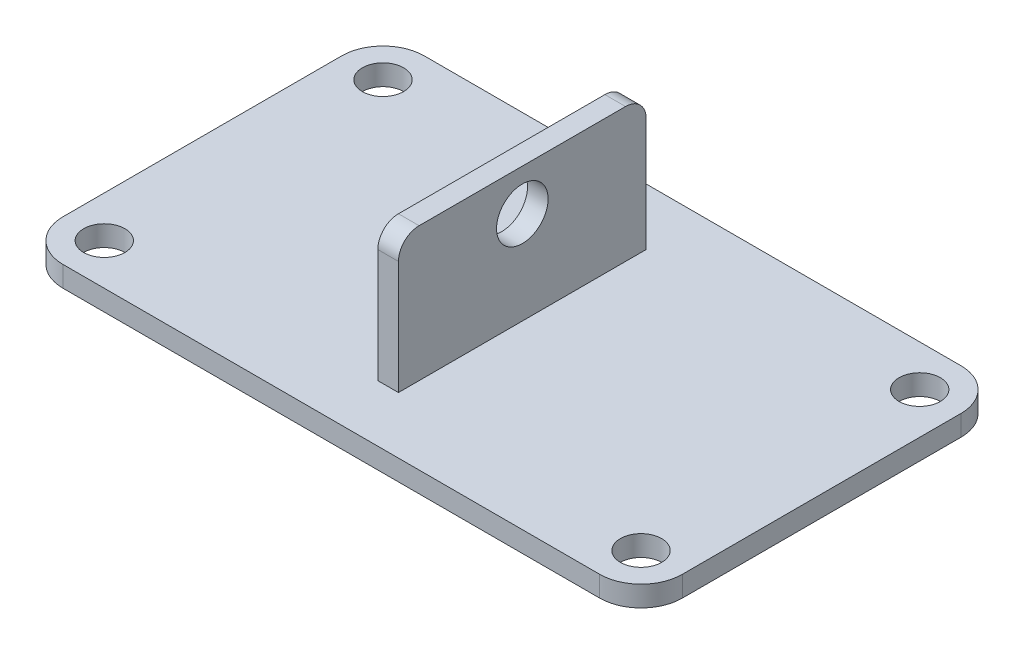
ISO-10303-21;
HEADER;
FILE_DESCRIPTION(('STEP AP214'),'2;1');
FILE_NAME('part.step','',(''),(''),'','','');
FILE_SCHEMA(('AUTOMOTIVE_DESIGN { 1 0 10303 214 1 1 1 1 }'));
ENDSEC;
DATA;
#1=APPLICATION_CONTEXT('core data for automotive mechanical design processes');
#2=APPLICATION_PROTOCOL_DEFINITION('international standard','automotive_design',2000,#1);
#3=PRODUCT_CONTEXT('',#1,'mechanical');
#4=PRODUCT('Part','Part','',(#3));
#5=PRODUCT_RELATED_PRODUCT_CATEGORY('part','',(#4));
#6=PRODUCT_DEFINITION_FORMATION('','',#4);
#7=PRODUCT_DEFINITION_CONTEXT('part definition',#1,'design');
#8=PRODUCT_DEFINITION('design','',#6,#7);
#9=PRODUCT_DEFINITION_SHAPE('','',#8);
#10=(LENGTH_UNIT() NAMED_UNIT(*) SI_UNIT(.MILLI.,.METRE.));
#11=(NAMED_UNIT(*) PLANE_ANGLE_UNIT() SI_UNIT($,.RADIAN.));
#12=(NAMED_UNIT(*) SI_UNIT($,.STERADIAN.) SOLID_ANGLE_UNIT());
#13=UNCERTAINTY_MEASURE_WITH_UNIT(LENGTH_MEASURE(1.E-05),#10,'distance_accuracy_value','');
#14=(GEOMETRIC_REPRESENTATION_CONTEXT(3) GLOBAL_UNCERTAINTY_ASSIGNED_CONTEXT((#13)) GLOBAL_UNIT_ASSIGNED_CONTEXT((#10,
#11,#12)) REPRESENTATION_CONTEXT('',''));
#15=CARTESIAN_POINT('',(0.,0.,0.));
#16=DIRECTION('',(0.,0.,1.));
#17=DIRECTION('',(1.,0.,0.));
#18=AXIS2_PLACEMENT_3D('',#15,#16,#17);
#19=CARTESIAN_POINT('',(0.,75.,-60.));
#20=DIRECTION('',(0.,0.,-1.));
#21=DIRECTION('',(-1.,0.,0.));
#22=AXIS2_PLACEMENT_3D('',#19,#20,#21);
#23=PLANE('',#22);
#24=DIRECTION('',(0.,-1.,0.));
#25=VECTOR('',#24,1.);
#26=CARTESIAN_POINT('',(-4.99999999999998,75.,-60.));
#27=LINE('',#26,#25);
#28=CARTESIAN_POINT('',(-4.99999999999998,64.9999999999999,-60.));
#29=VERTEX_POINT('',#28);
#30=CARTESIAN_POINT('',(-4.99999999999998,9.99999999999999,-60.));
#31=VERTEX_POINT('',#30);
#32=EDGE_CURVE('E182',#29,#31,#27,.T.);
#33=ORIENTED_EDGE('',*,*,#32,.F.);
#34=DIRECTION('',(1.,0.,0.));
#35=VECTOR('',#34,1.);
#36=CARTESIAN_POINT('',(-4.99999999999998,64.9999999999999,-60.));
#37=LINE('',#36,#35);
#38=CARTESIAN_POINT('',(5.00000000000002,64.9999999999999,-60.));
#39=VERTEX_POINT('',#38);
#40=EDGE_CURVE('E367',#29,#39,#37,.T.);
#41=ORIENTED_EDGE('',*,*,#40,.T.);
#42=DIRECTION('',(0.,-1.,0.));
#43=VECTOR('',#42,1.);
#44=CARTESIAN_POINT('',(5.00000000000002,75.,-60.));
#45=LINE('',#44,#43);
#46=CARTESIAN_POINT('',(5.00000000000002,9.99999999999999,-60.));
#47=VERTEX_POINT('',#46);
#48=EDGE_CURVE('E184',#39,#47,#45,.T.);
#49=ORIENTED_EDGE('',*,*,#48,.T.);
#50=DIRECTION('',(-1.,0.,0.));
#51=VECTOR('',#50,1.);
#52=CARTESIAN_POINT('',(0.,10.,-60.));
#53=LINE('',#52,#51);
#54=EDGE_CURVE('E205',#47,#31,#53,.T.);
#55=ORIENTED_EDGE('',*,*,#54,.T.);
#56=EDGE_LOOP('',(#33,#41,#49,#55));
#57=FACE_BOUND('',#56,.T.);
#58=ADVANCED_FACE('F65',(#57),#23,.T.);
#59=CARTESIAN_POINT('',(0.,75.,0.));
#60=DIRECTION('',(0.,1.,0.));
#61=DIRECTION('',(0.,0.,1.));
#62=AXIS2_PLACEMENT_3D('',#59,#60,#61);
#63=PLANE('',#62);
#64=DIRECTION('',(1.,0.,0.));
#65=VECTOR('',#64,1.);
#66=CARTESIAN_POINT('',(-4.99999999999998,75.,-50.));
#67=LINE('',#66,#65);
#68=CARTESIAN_POINT('',(-4.99999999999998,75.,-50.));
#69=VERTEX_POINT('',#68);
#70=CARTESIAN_POINT('',(5.00000000000002,75.,-50.));
#71=VERTEX_POINT('',#70);
#72=EDGE_CURVE('E81',#69,#71,#67,.T.);
#73=ORIENTED_EDGE('',*,*,#72,.F.);
#74=DIRECTION('',(0.,0.,-1.));
#75=VECTOR('',#74,1.);
#76=CARTESIAN_POINT('',(-4.99999999999998,75.,0.));
#77=LINE('',#76,#75);
#78=CARTESIAN_POINT('',(-4.99999999999998,75.,49.9999999999999));
#79=VERTEX_POINT('',#78);
#80=EDGE_CURVE('E177',#79,#69,#77,.T.);
#81=ORIENTED_EDGE('',*,*,#80,.F.);
#82=DIRECTION('',(1.,0.,0.));
#83=VECTOR('',#82,1.);
#84=CARTESIAN_POINT('',(-4.99999999999998,75.,49.9999999999999));
#85=LINE('',#84,#83);
#86=CARTESIAN_POINT('',(5.00000000000002,75.,49.9999999999999));
#87=VERTEX_POINT('',#86);
#88=EDGE_CURVE('E159',#79,#87,#85,.T.);
#89=ORIENTED_EDGE('',*,*,#88,.T.);
#90=DIRECTION('',(0.,0.,-1.));
#91=VECTOR('',#90,1.);
#92=CARTESIAN_POINT('',(5.00000000000002,75.,60.));
#93=LINE('',#92,#91);
#94=EDGE_CURVE('E187',#87,#71,#93,.T.);
#95=ORIENTED_EDGE('',*,*,#94,.T.);
#96=EDGE_LOOP('',(#73,#81,#89,#95));
#97=FACE_BOUND('',#96,.T.);
#98=ADVANCED_FACE('F176',(#97),#63,.T.);
#99=CARTESIAN_POINT('',(-4.99999999999998,75.,60.));
#100=DIRECTION('',(0.,0.,-1.));
#101=DIRECTION('',(-1.,0.,0.));
#102=AXIS2_PLACEMENT_3D('',#99,#100,#101);
#103=PLANE('',#102);
#104=DIRECTION('',(1.,0.,0.));
#105=VECTOR('',#104,1.);
#106=CARTESIAN_POINT('',(-4.99999999999998,64.9999999999999,60.));
#107=LINE('',#106,#105);
#108=CARTESIAN_POINT('',(-4.99999999999998,64.9999999999999,60.));
#109=VERTEX_POINT('',#108);
#110=CARTESIAN_POINT('',(5.00000000000002,65.,60.));
#111=VERTEX_POINT('',#110);
#112=EDGE_CURVE('E80',#109,#111,#107,.T.);
#113=ORIENTED_EDGE('',*,*,#112,.F.);
#114=DIRECTION('',(0.,-1.,0.));
#115=VECTOR('',#114,1.);
#116=CARTESIAN_POINT('',(-4.99999999999998,75.,60.));
#117=LINE('',#116,#115);
#118=CARTESIAN_POINT('',(-4.99999999999998,9.99999999999999,60.));
#119=VERTEX_POINT('',#118);
#120=EDGE_CURVE('E178',#109,#119,#117,.T.);
#121=ORIENTED_EDGE('',*,*,#120,.T.);
#122=DIRECTION('',(-1.,0.,0.));
#123=VECTOR('',#122,1.);
#124=CARTESIAN_POINT('',(0.,10.,60.));
#125=LINE('',#124,#123);
#126=CARTESIAN_POINT('',(5.00000000000002,10.,60.));
#127=VERTEX_POINT('',#126);
#128=EDGE_CURVE('E200',#127,#119,#125,.T.);
#129=ORIENTED_EDGE('',*,*,#128,.F.);
#130=DIRECTION('',(0.,-1.,0.));
#131=VECTOR('',#130,1.);
#132=CARTESIAN_POINT('',(5.00000000000002,75.,60.));
#133=LINE('',#132,#131);
#134=EDGE_CURVE('E185',#111,#127,#133,.T.);
#135=ORIENTED_EDGE('',*,*,#134,.F.);
#136=EDGE_LOOP('',(#113,#121,#129,#135));
#137=FACE_BOUND('',#136,.T.);
#138=ADVANCED_FACE('F341',(#137),#103,.F.);
#139=CARTESIAN_POINT('',(-130.,10.,-67.5));
#140=DIRECTION('',(0.,-1.,0.));
#141=DIRECTION('',(0.,0.,-1.));
#142=AXIS2_PLACEMENT_3D('',#139,#140,#141);
#143=CYLINDRICAL_SURFACE('',#142,20.);
#144=CARTESIAN_POINT('',(-130.,0.,-67.5));
#145=DIRECTION('',(0.,1.,0.));
#146=DIRECTION('',(0.,0.,1.));
#147=AXIS2_PLACEMENT_3D('',#144,#145,#146);
#148=CIRCLE('',#147,20.);
#149=CARTESIAN_POINT('',(-150.,0.,-67.4999999999999));
#150=VERTEX_POINT('',#149);
#151=CARTESIAN_POINT('',(-130.,0.,-87.5));
#152=VERTEX_POINT('',#151);
#153=EDGE_CURVE('E258',#150,#152,#148,.F.);
#154=ORIENTED_EDGE('',*,*,#153,.F.);
#155=DIRECTION('',(0.,-1.,0.));
#156=VECTOR('',#155,1.);
#157=CARTESIAN_POINT('',(-150.,10.,-67.4999999999999));
#158=LINE('',#157,#156);
#159=CARTESIAN_POINT('',(-150.,10.,-67.4999999999999));
#160=VERTEX_POINT('',#159);
#161=EDGE_CURVE('E12',#160,#150,#158,.T.);
#162=ORIENTED_EDGE('',*,*,#161,.F.);
#163=CARTESIAN_POINT('',(-130.,10.,-67.5));
#164=DIRECTION('',(0.,1.,0.));
#165=DIRECTION('',(0.,0.,1.));
#166=AXIS2_PLACEMENT_3D('',#163,#164,#165);
#167=CIRCLE('',#166,20.);
#168=CARTESIAN_POINT('',(-130.,10.,-87.5));
#169=VERTEX_POINT('',#168);
#170=EDGE_CURVE('E222',#160,#169,#167,.F.);
#171=ORIENTED_EDGE('',*,*,#170,.T.);
#172=DIRECTION('',(0.,-1.,0.));
#173=VECTOR('',#172,1.);
#174=CARTESIAN_POINT('',(-130.,10.,-87.5));
#175=LINE('',#174,#173);
#176=EDGE_CURVE('E241',#169,#152,#175,.T.);
#177=ORIENTED_EDGE('',*,*,#176,.T.);
#178=EDGE_LOOP('',(#154,#162,#171,#177));
#179=FACE_BOUND('',#178,.T.);
#180=ADVANCED_FACE('F307',(#179),#143,.T.);
#181=CARTESIAN_POINT('',(-150.,10.,0.));
#182=DIRECTION('',(-1.,0.,0.));
#183=DIRECTION('',(0.,0.,1.));
#184=AXIS2_PLACEMENT_3D('',#181,#182,#183);
#185=PLANE('',#184);
#186=DIRECTION('',(0.,0.,-1.));
#187=VECTOR('',#186,1.);
#188=CARTESIAN_POINT('',(-150.,0.,0.));
#189=LINE('',#188,#187);
#190=CARTESIAN_POINT('',(-150.,0.,67.4999999999999));
#191=VERTEX_POINT('',#190);
#192=EDGE_CURVE('E259',#191,#150,#189,.T.);
#193=ORIENTED_EDGE('',*,*,#192,.F.);
#194=DIRECTION('',(0.,-1.,0.));
#195=VECTOR('',#194,1.);
#196=CARTESIAN_POINT('',(-150.,10.,67.4999999999999));
#197=LINE('',#196,#195);
#198=CARTESIAN_POINT('',(-150.,10.,67.4999999999999));
#199=VERTEX_POINT('',#198);
#200=EDGE_CURVE('E66',#199,#191,#197,.T.);
#201=ORIENTED_EDGE('',*,*,#200,.F.);
#202=DIRECTION('',(0.,0.,-1.));
#203=VECTOR('',#202,1.);
#204=CARTESIAN_POINT('',(-150.,10.,0.));
#205=LINE('',#204,#203);
#206=EDGE_CURVE('E221',#199,#160,#205,.T.);
#207=ORIENTED_EDGE('',*,*,#206,.T.);
#208=ORIENTED_EDGE('',*,*,#161,.T.);
#209=EDGE_LOOP('',(#193,#201,#207,#208));
#210=FACE_BOUND('',#209,.T.);
#211=ADVANCED_FACE('F303',(#210),#185,.T.);
#212=CARTESIAN_POINT('',(-130.,10.,67.5));
#213=DIRECTION('',(0.,-1.,0.));
#214=DIRECTION('',(0.,0.,-1.));
#215=AXIS2_PLACEMENT_3D('',#212,#213,#214);
#216=CYLINDRICAL_SURFACE('',#215,20.);
#217=CARTESIAN_POINT('',(-130.,0.,67.5));
#218=DIRECTION('',(0.,1.,0.));
#219=DIRECTION('',(0.,0.,1.));
#220=AXIS2_PLACEMENT_3D('',#217,#218,#219);
#221=CIRCLE('',#220,20.);
#222=CARTESIAN_POINT('',(-130.,0.,87.5));
#223=VERTEX_POINT('',#222);
#224=EDGE_CURVE('E265',#191,#223,#221,.T.);
#225=ORIENTED_EDGE('',*,*,#224,.T.);
#226=DIRECTION('',(0.,-1.,0.));
#227=VECTOR('',#226,1.);
#228=CARTESIAN_POINT('',(-130.,10.,87.5));
#229=LINE('',#228,#227);
#230=CARTESIAN_POINT('',(-130.,10.,87.5));
#231=VERTEX_POINT('',#230);
#232=EDGE_CURVE('E292',#231,#223,#229,.T.);
#233=ORIENTED_EDGE('',*,*,#232,.F.);
#234=CARTESIAN_POINT('',(-130.,10.,67.5));
#235=DIRECTION('',(0.,1.,0.));
#236=DIRECTION('',(0.,0.,1.));
#237=AXIS2_PLACEMENT_3D('',#234,#235,#236);
#238=CIRCLE('',#237,20.);
#239=EDGE_CURVE('E230',#199,#231,#238,.T.);
#240=ORIENTED_EDGE('',*,*,#239,.F.);
#241=ORIENTED_EDGE('',*,*,#200,.T.);
#242=EDGE_LOOP('',(#225,#233,#240,#241));
#243=FACE_BOUND('',#242,.T.);
#244=ADVANCED_FACE('F297',(#243),#216,.T.);
#245=CARTESIAN_POINT('',(0.,10.,87.5));
#246=DIRECTION('',(0.,0.,-1.));
#247=DIRECTION('',(-1.,0.,0.));
#248=AXIS2_PLACEMENT_3D('',#245,#246,#247);
#249=PLANE('',#248);
#250=DIRECTION('',(1.,0.,0.));
#251=VECTOR('',#250,1.);
#252=CARTESIAN_POINT('',(0.,0.,87.5));
#253=LINE('',#252,#251);
#254=CARTESIAN_POINT('',(130.,0.,87.5));
#255=VERTEX_POINT('',#254);
#256=EDGE_CURVE('E264',#223,#255,#253,.T.);
#257=ORIENTED_EDGE('',*,*,#256,.T.);
#258=DIRECTION('',(0.,-1.,0.));
#259=VECTOR('',#258,1.);
#260=CARTESIAN_POINT('',(130.,10.,87.5));
#261=LINE('',#260,#259);
#262=CARTESIAN_POINT('',(130.,10.,87.5));
#263=VERTEX_POINT('',#262);
#264=EDGE_CURVE('E288',#263,#255,#261,.T.);
#265=ORIENTED_EDGE('',*,*,#264,.F.);
#266=DIRECTION('',(1.,0.,0.));
#267=VECTOR('',#266,1.);
#268=CARTESIAN_POINT('',(0.,10.,87.5));
#269=LINE('',#268,#267);
#270=EDGE_CURVE('E228',#231,#263,#269,.T.);
#271=ORIENTED_EDGE('',*,*,#270,.F.);
#272=ORIENTED_EDGE('',*,*,#232,.T.);
#273=EDGE_LOOP('',(#257,#265,#271,#272));
#274=FACE_BOUND('',#273,.T.);
#275=ADVANCED_FACE('F323',(#274),#249,.F.);
#276=CARTESIAN_POINT('',(130.,10.,67.5));
#277=DIRECTION('',(0.,-1.,0.));
#278=DIRECTION('',(0.,0.,-1.));
#279=AXIS2_PLACEMENT_3D('',#276,#277,#278);
#280=CYLINDRICAL_SURFACE('',#279,20.);
#281=CARTESIAN_POINT('',(130.,0.,67.5));
#282=DIRECTION('',(0.,1.,0.));
#283=DIRECTION('',(0.,0.,1.));
#284=AXIS2_PLACEMENT_3D('',#281,#282,#283);
#285=CIRCLE('',#284,20.);
#286=CARTESIAN_POINT('',(150.,0.,67.4999999999999));
#287=VERTEX_POINT('',#286);
#288=EDGE_CURVE('E268',#255,#287,#285,.T.);
#289=ORIENTED_EDGE('',*,*,#288,.T.);
#290=DIRECTION('',(0.,-1.,0.));
#291=VECTOR('',#290,1.);
#292=CARTESIAN_POINT('',(150.,10.,67.4999999999999));
#293=LINE('',#292,#291);
#294=CARTESIAN_POINT('',(150.,10.,67.4999999999999));
#295=VERTEX_POINT('',#294);
#296=EDGE_CURVE('E283',#295,#287,#293,.T.);
#297=ORIENTED_EDGE('',*,*,#296,.F.);
#298=CARTESIAN_POINT('',(130.,10.,67.5));
#299=DIRECTION('',(0.,1.,0.));
#300=DIRECTION('',(0.,0.,1.));
#301=AXIS2_PLACEMENT_3D('',#298,#299,#300);
#302=CIRCLE('',#301,20.);
#303=EDGE_CURVE('E233',#263,#295,#302,.T.);
#304=ORIENTED_EDGE('',*,*,#303,.F.);
#305=ORIENTED_EDGE('',*,*,#264,.T.);
#306=EDGE_LOOP('',(#289,#297,#304,#305));
#307=FACE_BOUND('',#306,.T.);
#308=ADVANCED_FACE('F319',(#307),#280,.T.);
#309=CARTESIAN_POINT('',(150.,10.,0.));
#310=DIRECTION('',(-1.,0.,0.));
#311=DIRECTION('',(0.,0.,1.));
#312=AXIS2_PLACEMENT_3D('',#309,#310,#311);
#313=PLANE('',#312);
#314=DIRECTION('',(0.,0.,-1.));
#315=VECTOR('',#314,1.);
#316=CARTESIAN_POINT('',(150.,0.,0.));
#317=LINE('',#316,#315);
#318=CARTESIAN_POINT('',(150.,0.,-67.4999999999999));
#319=VERTEX_POINT('',#318);
#320=EDGE_CURVE('E271',#287,#319,#317,.T.);
#321=ORIENTED_EDGE('',*,*,#320,.T.);
#322=DIRECTION('',(0.,-1.,0.));
#323=VECTOR('',#322,1.);
#324=CARTESIAN_POINT('',(150.,10.,-67.4999999999999));
#325=LINE('',#324,#323);
#326=CARTESIAN_POINT('',(150.,10.,-67.4999999999999));
#327=VERTEX_POINT('',#326);
#328=EDGE_CURVE('E285',#327,#319,#325,.T.);
#329=ORIENTED_EDGE('',*,*,#328,.F.);
#330=DIRECTION('',(0.,0.,-1.));
#331=VECTOR('',#330,1.);
#332=CARTESIAN_POINT('',(150.,10.,0.));
#333=LINE('',#332,#331);
#334=EDGE_CURVE('E237',#295,#327,#333,.T.);
#335=ORIENTED_EDGE('',*,*,#334,.F.);
#336=ORIENTED_EDGE('',*,*,#296,.T.);
#337=EDGE_LOOP('',(#321,#329,#335,#336));
#338=FACE_BOUND('',#337,.T.);
#339=ADVANCED_FACE('F318',(#338),#313,.F.);
#340=CARTESIAN_POINT('',(130.,10.,-67.5));
#341=DIRECTION('',(0.,-1.,0.));
#342=DIRECTION('',(0.,0.,-1.));
#343=AXIS2_PLACEMENT_3D('',#340,#341,#342);
#344=CYLINDRICAL_SURFACE('',#343,20.);
#345=CARTESIAN_POINT('',(130.,0.,-67.5));
#346=DIRECTION('',(0.,1.,0.));
#347=DIRECTION('',(0.,0.,1.));
#348=AXIS2_PLACEMENT_3D('',#345,#346,#347);
#349=CIRCLE('',#348,20.);
#350=CARTESIAN_POINT('',(130.,0.,-87.5));
#351=VERTEX_POINT('',#350);
#352=EDGE_CURVE('E273',#319,#351,#349,.T.);
#353=ORIENTED_EDGE('',*,*,#352,.T.);
#354=DIRECTION('',(0.,-1.,0.));
#355=VECTOR('',#354,1.);
#356=CARTESIAN_POINT('',(130.,10.,-87.5));
#357=LINE('',#356,#355);
#358=CARTESIAN_POINT('',(130.,10.,-87.5));
#359=VERTEX_POINT('',#358);
#360=EDGE_CURVE('E278',#359,#351,#357,.T.);
#361=ORIENTED_EDGE('',*,*,#360,.F.);
#362=CARTESIAN_POINT('',(130.,10.,-67.5));
#363=DIRECTION('',(0.,1.,0.));
#364=DIRECTION('',(0.,0.,1.));
#365=AXIS2_PLACEMENT_3D('',#362,#363,#364);
#366=CIRCLE('',#365,20.);
#367=EDGE_CURVE('E239',#327,#359,#366,.T.);
#368=ORIENTED_EDGE('',*,*,#367,.F.);
#369=ORIENTED_EDGE('',*,*,#328,.T.);
#370=EDGE_LOOP('',(#353,#361,#368,#369));
#371=FACE_BOUND('',#370,.T.);
#372=ADVANCED_FACE('F314',(#371),#344,.T.);
#373=CARTESIAN_POINT('',(130.,10.,-67.5));
#374=DIRECTION('',(0.,-1.,0.));
#375=DIRECTION('',(0.,0.,-1.));
#376=AXIS2_PLACEMENT_3D('',#373,#374,#375);
#377=CYLINDRICAL_SURFACE('',#376,10.);
#378=CARTESIAN_POINT('',(130.,10.,-67.5));
#379=DIRECTION('',(0.,1.,0.));
#380=DIRECTION('',(0.,0.,1.));
#381=AXIS2_PLACEMENT_3D('',#378,#379,#380);
#382=CIRCLE('',#381,10.);
#383=CARTESIAN_POINT('',(130.,10.,-57.5));
#384=VERTEX_POINT('',#383);
#385=EDGE_CURVE('E217',#384,#384,#382,.T.);
#386=ORIENTED_EDGE('',*,*,#385,.T.);
#387=EDGE_LOOP('',(#386));
#388=FACE_BOUND('',#387,.T.);
#389=CARTESIAN_POINT('',(130.,0.,-67.5));
#390=DIRECTION('',(0.,1.,0.));
#391=DIRECTION('',(0.,0.,1.));
#392=AXIS2_PLACEMENT_3D('',#389,#390,#391);
#393=CIRCLE('',#392,10.);
#394=CARTESIAN_POINT('',(130.,0.,-57.5));
#395=VERTEX_POINT('',#394);
#396=EDGE_CURVE('E251',#395,#395,#393,.T.);
#397=ORIENTED_EDGE('',*,*,#396,.F.);
#398=EDGE_LOOP('',(#397));
#399=FACE_BOUND('',#398,.T.);
#400=ADVANCED_FACE('F475',(#388,#399),#377,.F.);
#401=CARTESIAN_POINT('',(130.,10.,67.5));
#402=DIRECTION('',(0.,-1.,0.));
#403=DIRECTION('',(0.,0.,-1.));
#404=AXIS2_PLACEMENT_3D('',#401,#402,#403);
#405=CYLINDRICAL_SURFACE('',#404,10.);
#406=CARTESIAN_POINT('',(130.,10.,67.5));
#407=DIRECTION('',(0.,1.,0.));
#408=DIRECTION('',(0.,0.,1.));
#409=AXIS2_PLACEMENT_3D('',#406,#407,#408);
#410=CIRCLE('',#409,10.);
#411=CARTESIAN_POINT('',(130.,10.,77.5));
#412=VERTEX_POINT('',#411);
#413=EDGE_CURVE('E214',#412,#412,#410,.T.);
#414=ORIENTED_EDGE('',*,*,#413,.T.);
#415=EDGE_LOOP('',(#414));
#416=FACE_BOUND('',#415,.T.);
#417=CARTESIAN_POINT('',(130.,0.,67.5));
#418=DIRECTION('',(0.,1.,0.));
#419=DIRECTION('',(0.,0.,1.));
#420=AXIS2_PLACEMENT_3D('',#417,#418,#419);
#421=CIRCLE('',#420,10.);
#422=CARTESIAN_POINT('',(130.,0.,77.5));
#423=VERTEX_POINT('',#422);
#424=EDGE_CURVE('E246',#423,#423,#421,.T.);
#425=ORIENTED_EDGE('',*,*,#424,.F.);
#426=EDGE_LOOP('',(#425));
#427=FACE_BOUND('',#426,.T.);
#428=ADVANCED_FACE('F467',(#416,#427),#405,.F.);
#429=CARTESIAN_POINT('',(-130.,10.,-67.5));
#430=DIRECTION('',(0.,-1.,0.));
#431=DIRECTION('',(0.,0.,-1.));
#432=AXIS2_PLACEMENT_3D('',#429,#430,#431);
#433=CYLINDRICAL_SURFACE('',#432,9.99999999999999);
#434=CARTESIAN_POINT('',(-130.,10.,-67.5));
#435=DIRECTION('',(0.,1.,0.));
#436=DIRECTION('',(0.,0.,1.));
#437=AXIS2_PLACEMENT_3D('',#434,#435,#436);
#438=CIRCLE('',#437,9.99999999999999);
#439=CARTESIAN_POINT('',(-130.,10.,-57.5));
#440=VERTEX_POINT('',#439);
#441=EDGE_CURVE('E211',#440,#440,#438,.T.);
#442=ORIENTED_EDGE('',*,*,#441,.T.);
#443=EDGE_LOOP('',(#442));
#444=FACE_BOUND('',#443,.T.);
#445=CARTESIAN_POINT('',(-130.,0.,-67.5));
#446=DIRECTION('',(0.,1.,0.));
#447=DIRECTION('',(0.,0.,1.));
#448=AXIS2_PLACEMENT_3D('',#445,#446,#447);
#449=CIRCLE('',#448,9.99999999999999);
#450=CARTESIAN_POINT('',(-130.,0.,-57.5));
#451=VERTEX_POINT('',#450);
#452=EDGE_CURVE('E250',#451,#451,#449,.T.);
#453=ORIENTED_EDGE('',*,*,#452,.F.);
#454=EDGE_LOOP('',(#453));
#455=FACE_BOUND('',#454,.T.);
#456=ADVANCED_FACE('F456',(#444,#455),#433,.F.);
#457=CARTESIAN_POINT('',(-130.,10.,67.5));
#458=DIRECTION('',(0.,-1.,0.));
#459=DIRECTION('',(0.,0.,-1.));
#460=AXIS2_PLACEMENT_3D('',#457,#458,#459);
#461=CYLINDRICAL_SURFACE('',#460,9.99999999999999);
#462=CARTESIAN_POINT('',(-130.,10.,67.5));
#463=DIRECTION('',(0.,1.,0.));
#464=DIRECTION('',(0.,0.,1.));
#465=AXIS2_PLACEMENT_3D('',#462,#463,#464);
#466=CIRCLE('',#465,9.99999999999999);
#467=CARTESIAN_POINT('',(-130.,10.,77.5));
#468=VERTEX_POINT('',#467);
#469=EDGE_CURVE('E208',#468,#468,#466,.T.);
#470=ORIENTED_EDGE('',*,*,#469,.T.);
#471=EDGE_LOOP('',(#470));
#472=FACE_BOUND('',#471,.T.);
#473=CARTESIAN_POINT('',(-130.,0.,67.5));
#474=DIRECTION('',(0.,1.,0.));
#475=DIRECTION('',(0.,0.,1.));
#476=AXIS2_PLACEMENT_3D('',#473,#474,#475);
#477=CIRCLE('',#476,9.99999999999999);
#478=CARTESIAN_POINT('',(-130.,0.,77.5));
#479=VERTEX_POINT('',#478);
#480=EDGE_CURVE('E210',#479,#479,#477,.T.);
#481=ORIENTED_EDGE('',*,*,#480,.F.);
#482=EDGE_LOOP('',(#481));
#483=FACE_BOUND('',#482,.T.);
#484=ADVANCED_FACE('F61',(#472,#483),#461,.F.);
#485=CARTESIAN_POINT('',(0.,10.,-87.5));
#486=DIRECTION('',(0.,0.,-1.));
#487=DIRECTION('',(-1.,0.,0.));
#488=AXIS2_PLACEMENT_3D('',#485,#486,#487);
#489=PLANE('',#488);
#490=DIRECTION('',(1.,0.,0.));
#491=VECTOR('',#490,1.);
#492=CARTESIAN_POINT('',(0.,0.,-87.5));
#493=LINE('',#492,#491);
#494=EDGE_CURVE('E215',#152,#351,#493,.T.);
#495=ORIENTED_EDGE('',*,*,#494,.F.);
#496=ORIENTED_EDGE('',*,*,#176,.F.);
#497=DIRECTION('',(1.,0.,0.));
#498=VECTOR('',#497,1.);
#499=CARTESIAN_POINT('',(0.,10.,-87.5));
#500=LINE('',#499,#498);
#501=EDGE_CURVE('E242',#169,#359,#500,.T.);
#502=ORIENTED_EDGE('',*,*,#501,.T.);
#503=ORIENTED_EDGE('',*,*,#360,.T.);
#504=EDGE_LOOP('',(#495,#496,#502,#503));
#505=FACE_BOUND('',#504,.T.);
#506=ADVANCED_FACE('F309',(#505),#489,.T.);
#507=CARTESIAN_POINT('',(0.,10.,0.));
#508=DIRECTION('',(0.,1.,0.));
#509=DIRECTION('',(0.,0.,1.));
#510=AXIS2_PLACEMENT_3D('',#507,#508,#509);
#511=PLANE('',#510);
#512=DIRECTION('',(0.,0.,1.));
#513=VECTOR('',#512,1.);
#514=CARTESIAN_POINT('',(-4.99999999999998,10.,0.));
#515=LINE('',#514,#513);
#516=EDGE_CURVE('E202',#31,#119,#515,.T.);
#517=ORIENTED_EDGE('',*,*,#516,.F.);
#518=ORIENTED_EDGE('',*,*,#54,.F.);
#519=DIRECTION('',(0.,0.,1.));
#520=VECTOR('',#519,1.);
#521=CARTESIAN_POINT('',(5.00000000000002,10.,0.));
#522=LINE('',#521,#520);
#523=EDGE_CURVE('E194',#47,#127,#522,.T.);
#524=ORIENTED_EDGE('',*,*,#523,.T.);
#525=ORIENTED_EDGE('',*,*,#128,.T.);
#526=EDGE_LOOP('',(#517,#518,#524,#525));
#527=FACE_BOUND('',#526,.T.);
#528=ORIENTED_EDGE('',*,*,#469,.F.);
#529=EDGE_LOOP('',(#528));
#530=FACE_BOUND('',#529,.T.);
#531=ORIENTED_EDGE('',*,*,#441,.F.);
#532=EDGE_LOOP('',(#531));
#533=FACE_BOUND('',#532,.T.);
#534=ORIENTED_EDGE('',*,*,#413,.F.);
#535=EDGE_LOOP('',(#534));
#536=FACE_BOUND('',#535,.T.);
#537=ORIENTED_EDGE('',*,*,#385,.F.);
#538=EDGE_LOOP('',(#537));
#539=FACE_BOUND('',#538,.T.);
#540=ORIENTED_EDGE('',*,*,#170,.F.);
#541=ORIENTED_EDGE('',*,*,#206,.F.);
#542=ORIENTED_EDGE('',*,*,#239,.T.);
#543=ORIENTED_EDGE('',*,*,#270,.T.);
#544=ORIENTED_EDGE('',*,*,#303,.T.);
#545=ORIENTED_EDGE('',*,*,#334,.T.);
#546=ORIENTED_EDGE('',*,*,#367,.T.);
#547=ORIENTED_EDGE('',*,*,#501,.F.);
#548=EDGE_LOOP('',(#540,#541,#542,#543,#544,#545,#546,#547));
#549=FACE_BOUND('',#548,.T.);
#550=ADVANCED_FACE('F324',(#527,#530,#533,#536,#539,#549),#511,.T.);
#551=CARTESIAN_POINT('',(0.,0.,0.));
#552=DIRECTION('',(0.,1.,0.));
#553=DIRECTION('',(0.,0.,1.));
#554=AXIS2_PLACEMENT_3D('',#551,#552,#553);
#555=PLANE('',#554);
#556=ORIENTED_EDGE('',*,*,#480,.T.);
#557=EDGE_LOOP('',(#556));
#558=FACE_BOUND('',#557,.T.);
#559=ORIENTED_EDGE('',*,*,#452,.T.);
#560=EDGE_LOOP('',(#559));
#561=FACE_BOUND('',#560,.T.);
#562=ORIENTED_EDGE('',*,*,#424,.T.);
#563=EDGE_LOOP('',(#562));
#564=FACE_BOUND('',#563,.T.);
#565=ORIENTED_EDGE('',*,*,#396,.T.);
#566=EDGE_LOOP('',(#565));
#567=FACE_BOUND('',#566,.T.);
#568=ORIENTED_EDGE('',*,*,#153,.T.);
#569=ORIENTED_EDGE('',*,*,#494,.T.);
#570=ORIENTED_EDGE('',*,*,#352,.F.);
#571=ORIENTED_EDGE('',*,*,#320,.F.);
#572=ORIENTED_EDGE('',*,*,#288,.F.);
#573=ORIENTED_EDGE('',*,*,#256,.F.);
#574=ORIENTED_EDGE('',*,*,#224,.F.);
#575=ORIENTED_EDGE('',*,*,#192,.T.);
#576=EDGE_LOOP('',(#568,#569,#570,#571,#572,#573,#574,#575));
#577=FACE_BOUND('',#576,.T.);
#578=ADVANCED_FACE('F305',(#558,#561,#564,#567,#577),#555,.F.);
#579=CARTESIAN_POINT('',(-4.99999999999998,75.,0.));
#580=DIRECTION('',(-1.,0.,0.));
#581=DIRECTION('',(0.,0.,1.));
#582=AXIS2_PLACEMENT_3D('',#579,#580,#581);
#583=PLANE('',#582);
#584=CARTESIAN_POINT('',(-4.99999999999998,65.,-50.));
#585=DIRECTION('',(1.,0.,0.));
#586=DIRECTION('',(0.,0.,-1.));
#587=AXIS2_PLACEMENT_3D('',#584,#585,#586);
#588=CIRCLE('',#587,10.);
#589=EDGE_CURVE('E371',#29,#69,#588,.T.);
#590=ORIENTED_EDGE('',*,*,#589,.F.);
#591=ORIENTED_EDGE('',*,*,#32,.T.);
#592=ORIENTED_EDGE('',*,*,#516,.T.);
#593=ORIENTED_EDGE('',*,*,#120,.F.);
#594=CARTESIAN_POINT('',(-4.99999999999998,65.,50.));
#595=DIRECTION('',(1.,0.,0.));
#596=DIRECTION('',(0.,0.,-1.));
#597=AXIS2_PLACEMENT_3D('',#594,#595,#596);
#598=CIRCLE('',#597,10.);
#599=EDGE_CURVE('E162',#79,#109,#598,.T.);
#600=ORIENTED_EDGE('',*,*,#599,.F.);
#601=ORIENTED_EDGE('',*,*,#80,.T.);
#602=EDGE_LOOP('',(#590,#591,#592,#593,#600,#601));
#603=FACE_BOUND('',#602,.T.);
#604=CARTESIAN_POINT('',(-4.99999999999998,55.,0.));
#605=DIRECTION('',(1.,0.,0.));
#606=DIRECTION('',(0.,0.,-1.));
#607=AXIS2_PLACEMENT_3D('',#604,#605,#606);
#608=CIRCLE('',#607,12.5);
#609=CARTESIAN_POINT('',(-4.99999999999998,55.,-12.5));
#610=VERTEX_POINT('',#609);
#611=EDGE_CURVE('E191',#610,#610,#608,.T.);
#612=ORIENTED_EDGE('',*,*,#611,.T.);
#613=EDGE_LOOP('',(#612));
#614=FACE_BOUND('',#613,.T.);
#615=ADVANCED_FACE('F171',(#603,#614),#583,.T.);
#616=CARTESIAN_POINT('',(5.00000000000002,75.,60.));
#617=DIRECTION('',(-1.,0.,0.));
#618=DIRECTION('',(0.,0.,1.));
#619=AXIS2_PLACEMENT_3D('',#616,#617,#618);
#620=PLANE('',#619);
#621=CARTESIAN_POINT('',(5.00000000000002,55.,0.));
#622=DIRECTION('',(1.,0.,0.));
#623=DIRECTION('',(0.,0.,-1.));
#624=AXIS2_PLACEMENT_3D('',#621,#622,#623);
#625=CIRCLE('',#624,12.5);
#626=CARTESIAN_POINT('',(5.00000000000002,55.,-12.5));
#627=VERTEX_POINT('',#626);
#628=EDGE_CURVE('E186',#627,#627,#625,.T.);
#629=ORIENTED_EDGE('',*,*,#628,.F.);
#630=EDGE_LOOP('',(#629));
#631=FACE_BOUND('',#630,.T.);
#632=ORIENTED_EDGE('',*,*,#48,.F.);
#633=CARTESIAN_POINT('',(5.00000000000002,65.,-50.));
#634=DIRECTION('',(1.,0.,0.));
#635=DIRECTION('',(0.,0.,-1.));
#636=AXIS2_PLACEMENT_3D('',#633,#634,#635);
#637=CIRCLE('',#636,10.);
#638=EDGE_CURVE('E370',#39,#71,#637,.T.);
#639=ORIENTED_EDGE('',*,*,#638,.T.);
#640=ORIENTED_EDGE('',*,*,#94,.F.);
#641=CARTESIAN_POINT('',(5.00000000000002,65.,50.));
#642=DIRECTION('',(1.,0.,0.));
#643=DIRECTION('',(0.,0.,-1.));
#644=AXIS2_PLACEMENT_3D('',#641,#642,#643);
#645=CIRCLE('',#644,10.);
#646=EDGE_CURVE('E163',#87,#111,#645,.T.);
#647=ORIENTED_EDGE('',*,*,#646,.T.);
#648=ORIENTED_EDGE('',*,*,#134,.T.);
#649=ORIENTED_EDGE('',*,*,#523,.F.);
#650=EDGE_LOOP('',(#632,#639,#640,#647,#648,#649));
#651=FACE_BOUND('',#650,.T.);
#652=ADVANCED_FACE('F355',(#631,#651),#620,.F.);
#653=CARTESIAN_POINT('',(-4.99999999999998,55.,0.));
#654=DIRECTION('',(1.,0.,0.));
#655=DIRECTION('',(0.,0.,-1.));
#656=AXIS2_PLACEMENT_3D('',#653,#654,#655);
#657=CYLINDRICAL_SURFACE('',#656,12.5);
#658=ORIENTED_EDGE('',*,*,#611,.F.);
#659=EDGE_LOOP('',(#658));
#660=FACE_BOUND('',#659,.T.);
#661=ORIENTED_EDGE('',*,*,#628,.T.);
#662=EDGE_LOOP('',(#661));
#663=FACE_BOUND('',#662,.T.);
#664=ADVANCED_FACE('F357',(#660,#663),#657,.F.);
#665=CARTESIAN_POINT('',(-4.99999999999998,65.,50.));
#666=DIRECTION('',(1.,0.,0.));
#667=DIRECTION('',(0.,0.,-1.));
#668=AXIS2_PLACEMENT_3D('',#665,#666,#667);
#669=CYLINDRICAL_SURFACE('',#668,10.);
#670=ORIENTED_EDGE('',*,*,#646,.F.);
#671=ORIENTED_EDGE('',*,*,#88,.F.);
#672=ORIENTED_EDGE('',*,*,#599,.T.);
#673=ORIENTED_EDGE('',*,*,#112,.T.);
#674=EDGE_LOOP('',(#670,#671,#672,#673));
#675=FACE_BOUND('',#674,.T.);
#676=ADVANCED_FACE('F165',(#675),#669,.T.);
#677=CARTESIAN_POINT('',(-4.99999999999998,65.,-50.));
#678=DIRECTION('',(1.,0.,0.));
#679=DIRECTION('',(0.,0.,-1.));
#680=AXIS2_PLACEMENT_3D('',#677,#678,#679);
#681=CYLINDRICAL_SURFACE('',#680,10.);
#682=ORIENTED_EDGE('',*,*,#638,.F.);
#683=ORIENTED_EDGE('',*,*,#40,.F.);
#684=ORIENTED_EDGE('',*,*,#589,.T.);
#685=ORIENTED_EDGE('',*,*,#72,.T.);
#686=EDGE_LOOP('',(#682,#683,#684,#685));
#687=FACE_BOUND('',#686,.T.);
#688=ADVANCED_FACE('F382',(#687),#681,.T.);
#689=CLOSED_SHELL('',(#58,#98,#138,#180,#211,#244,#275,#308,#339,#372,#400,#428,#456,#484,#506,
#550,#578,#615,#652,#664,#676,#688));
#690=MANIFOLD_SOLID_BREP('B2',#689);
#691=ADVANCED_BREP_SHAPE_REPRESENTATION('',(#18,#690),#14);
#692=SHAPE_DEFINITION_REPRESENTATION(#9,#691);
ENDSEC;
END-ISO-10303-21;
